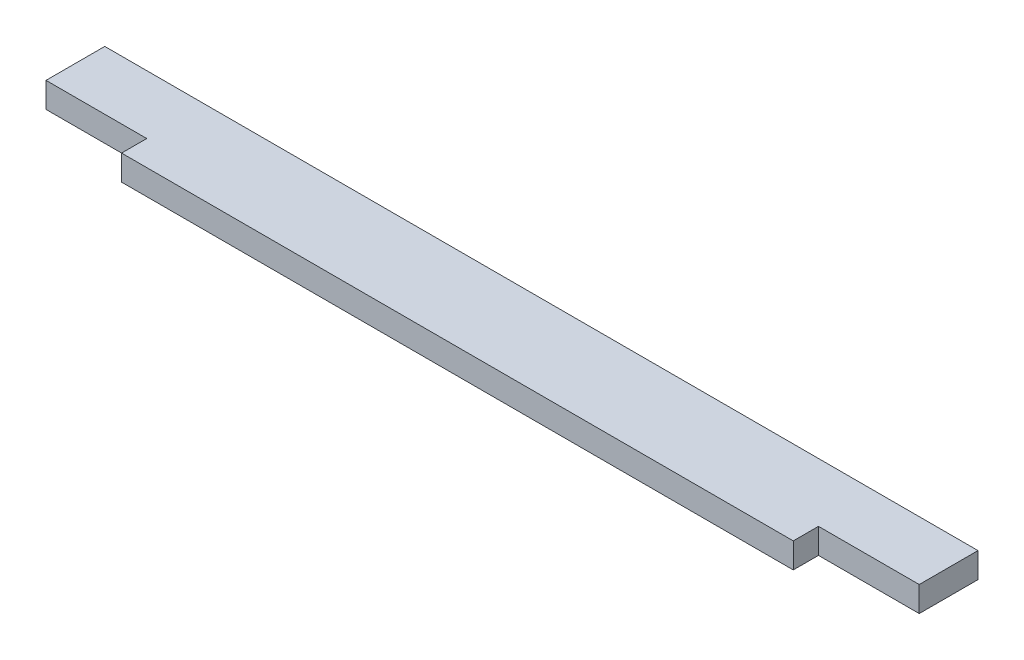
ISO-10303-21;
HEADER;
FILE_DESCRIPTION(('STEP AP214'),'2;1');
FILE_NAME('part.step','',(''),(''),'','','');
FILE_SCHEMA(('AUTOMOTIVE_DESIGN { 1 0 10303 214 1 1 1 1 }'));
ENDSEC;
DATA;
#1=APPLICATION_CONTEXT('core data for automotive mechanical design processes');
#2=APPLICATION_PROTOCOL_DEFINITION('international standard','automotive_design',2000,#1);
#3=PRODUCT_CONTEXT('',#1,'mechanical');
#4=PRODUCT('Part','Part','',(#3));
#5=PRODUCT_RELATED_PRODUCT_CATEGORY('part','',(#4));
#6=PRODUCT_DEFINITION_FORMATION('','',#4);
#7=PRODUCT_DEFINITION_CONTEXT('part definition',#1,'design');
#8=PRODUCT_DEFINITION('design','',#6,#7);
#9=PRODUCT_DEFINITION_SHAPE('','',#8);
#10=(LENGTH_UNIT() NAMED_UNIT(*) SI_UNIT(.MILLI.,.METRE.));
#11=(NAMED_UNIT(*) PLANE_ANGLE_UNIT() SI_UNIT($,.RADIAN.));
#12=(NAMED_UNIT(*) SI_UNIT($,.STERADIAN.) SOLID_ANGLE_UNIT());
#13=UNCERTAINTY_MEASURE_WITH_UNIT(LENGTH_MEASURE(1.E-05),#10,'distance_accuracy_value','');
#14=(GEOMETRIC_REPRESENTATION_CONTEXT(3) GLOBAL_UNCERTAINTY_ASSIGNED_CONTEXT((#13)) GLOBAL_UNIT_ASSIGNED_CONTEXT((#10,
#11,#12)) REPRESENTATION_CONTEXT('',''));
#15=CARTESIAN_POINT('',(0.,0.,0.));
#16=DIRECTION('',(0.,0.,1.));
#17=DIRECTION('',(1.,0.,0.));
#18=AXIS2_PLACEMENT_3D('',#15,#16,#17);
#19=CARTESIAN_POINT('',(52.,3.,-5.));
#20=DIRECTION('',(-1.,0.,0.));
#21=DIRECTION('',(0.,0.,1.));
#22=AXIS2_PLACEMENT_3D('',#19,#20,#21);
#23=PLANE('',#22);
#24=DIRECTION('',(0.,1.,0.));
#25=VECTOR('',#24,1.);
#26=CARTESIAN_POINT('',(52.,0.,1.99999999999999));
#27=LINE('',#26,#25);
#28=CARTESIAN_POINT('',(52.,0.,1.99999999999999));
#29=VERTEX_POINT('',#28);
#30=CARTESIAN_POINT('',(52.,3.,1.99999999999999));
#31=VERTEX_POINT('',#30);
#32=EDGE_CURVE('E127',#29,#31,#27,.T.);
#33=ORIENTED_EDGE('',*,*,#32,.F.);
#34=DIRECTION('',(0.,0.,-1.));
#35=VECTOR('',#34,1.);
#36=CARTESIAN_POINT('',(52.,0.,-5.));
#37=LINE('',#36,#35);
#38=CARTESIAN_POINT('',(52.,0.,-5.));
#39=VERTEX_POINT('',#38);
#40=EDGE_CURVE('E120',#29,#39,#37,.T.);
#41=ORIENTED_EDGE('',*,*,#40,.T.);
#42=DIRECTION('',(0.,-1.,0.));
#43=VECTOR('',#42,1.);
#44=CARTESIAN_POINT('',(52.,3.,-5.));
#45=LINE('',#44,#43);
#46=CARTESIAN_POINT('',(52.,3.,-5.));
#47=VERTEX_POINT('',#46);
#48=EDGE_CURVE('E11',#47,#39,#45,.T.);
#49=ORIENTED_EDGE('',*,*,#48,.F.);
#50=DIRECTION('',(0.,0.,-1.));
#51=VECTOR('',#50,1.);
#52=CARTESIAN_POINT('',(52.,3.,-5.));
#53=LINE('',#52,#51);
#54=EDGE_CURVE('E143',#31,#47,#53,.T.);
#55=ORIENTED_EDGE('',*,*,#54,.F.);
#56=EDGE_LOOP('',(#33,#41,#49,#55));
#57=FACE_BOUND('',#56,.T.);
#58=ADVANCED_FACE('F37',(#57),#23,.F.);
#59=CARTESIAN_POINT('',(-52.,3.,5.));
#60=DIRECTION('',(0.,0.,-1.));
#61=DIRECTION('',(-1.,0.,0.));
#62=AXIS2_PLACEMENT_3D('',#59,#60,#61);
#63=PLANE('',#62);
#64=DIRECTION('',(0.,1.,0.));
#65=VECTOR('',#64,1.);
#66=CARTESIAN_POINT('',(40.,0.,5.));
#67=LINE('',#66,#65);
#68=CARTESIAN_POINT('',(40.,0.,5.));
#69=VERTEX_POINT('',#68);
#70=CARTESIAN_POINT('',(40.,3.,5.));
#71=VERTEX_POINT('',#70);
#72=EDGE_CURVE('E59',#69,#71,#67,.T.);
#73=ORIENTED_EDGE('',*,*,#72,.T.);
#74=DIRECTION('',(1.,0.,0.));
#75=VECTOR('',#74,1.);
#76=CARTESIAN_POINT('',(-52.,3.,5.));
#77=LINE('',#76,#75);
#78=CARTESIAN_POINT('',(-40.,3.,5.));
#79=VERTEX_POINT('',#78);
#80=EDGE_CURVE('E151',#79,#71,#77,.T.);
#81=ORIENTED_EDGE('',*,*,#80,.F.);
#82=DIRECTION('',(0.,1.,0.));
#83=VECTOR('',#82,1.);
#84=CARTESIAN_POINT('',(-40.,0.,5.));
#85=LINE('',#84,#83);
#86=CARTESIAN_POINT('',(-40.,0.,5.));
#87=VERTEX_POINT('',#86);
#88=EDGE_CURVE('E125',#87,#79,#85,.T.);
#89=ORIENTED_EDGE('',*,*,#88,.F.);
#90=DIRECTION('',(1.,0.,0.));
#91=VECTOR('',#90,1.);
#92=CARTESIAN_POINT('',(-52.,0.,5.));
#93=LINE('',#92,#91);
#94=EDGE_CURVE('E146',#87,#69,#93,.T.);
#95=ORIENTED_EDGE('',*,*,#94,.T.);
#96=EDGE_LOOP('',(#73,#81,#89,#95));
#97=FACE_BOUND('',#96,.T.);
#98=ADVANCED_FACE('F183',(#97),#63,.F.);
#99=CARTESIAN_POINT('',(0.,3.,0.));
#100=DIRECTION('',(0.,1.,0.));
#101=DIRECTION('',(0.,0.,1.));
#102=AXIS2_PLACEMENT_3D('',#99,#100,#101);
#103=PLANE('',#102);
#104=DIRECTION('',(0.,0.,-1.));
#105=VECTOR('',#104,1.);
#106=CARTESIAN_POINT('',(40.,3.,0.));
#107=LINE('',#106,#105);
#108=CARTESIAN_POINT('',(40.,3.,1.99999999999999));
#109=VERTEX_POINT('',#108);
#110=EDGE_CURVE('E121',#71,#109,#107,.T.);
#111=ORIENTED_EDGE('',*,*,#110,.T.);
#112=DIRECTION('',(1.,0.,0.));
#113=VECTOR('',#112,1.);
#114=CARTESIAN_POINT('',(0.,3.,1.99999999999999));
#115=LINE('',#114,#113);
#116=EDGE_CURVE('E114',#109,#31,#115,.T.);
#117=ORIENTED_EDGE('',*,*,#116,.T.);
#118=ORIENTED_EDGE('',*,*,#54,.T.);
#119=DIRECTION('',(-1.,0.,0.));
#120=VECTOR('',#119,1.);
#121=CARTESIAN_POINT('',(-52.,3.,-5.));
#122=LINE('',#121,#120);
#123=CARTESIAN_POINT('',(-52.,3.,-5.));
#124=VERTEX_POINT('',#123);
#125=EDGE_CURVE('E145',#47,#124,#122,.T.);
#126=ORIENTED_EDGE('',*,*,#125,.T.);
#127=DIRECTION('',(0.,0.,1.));
#128=VECTOR('',#127,1.);
#129=CARTESIAN_POINT('',(-52.,3.,-5.));
#130=LINE('',#129,#128);
#131=CARTESIAN_POINT('',(-52.,3.,1.99999999999999));
#132=VERTEX_POINT('',#131);
#133=EDGE_CURVE('E148',#124,#132,#130,.T.);
#134=ORIENTED_EDGE('',*,*,#133,.T.);
#135=DIRECTION('',(-1.,0.,0.));
#136=VECTOR('',#135,1.);
#137=CARTESIAN_POINT('',(0.,3.,1.99999999999999));
#138=LINE('',#137,#136);
#139=CARTESIAN_POINT('',(-40.,3.,1.99999999999999));
#140=VERTEX_POINT('',#139);
#141=EDGE_CURVE('E133',#140,#132,#138,.T.);
#142=ORIENTED_EDGE('',*,*,#141,.F.);
#143=DIRECTION('',(0.,0.,1.));
#144=VECTOR('',#143,1.);
#145=CARTESIAN_POINT('',(-40.,3.,0.));
#146=LINE('',#145,#144);
#147=EDGE_CURVE('E136',#140,#79,#146,.T.);
#148=ORIENTED_EDGE('',*,*,#147,.T.);
#149=ORIENTED_EDGE('',*,*,#80,.T.);
#150=EDGE_LOOP('',(#111,#117,#118,#126,#134,#142,#148,#149));
#151=FACE_BOUND('',#150,.T.);
#152=ADVANCED_FACE('F177',(#151),#103,.T.);
#153=CARTESIAN_POINT('',(0.,0.,0.));
#154=DIRECTION('',(0.,1.,0.));
#155=DIRECTION('',(0.,0.,1.));
#156=AXIS2_PLACEMENT_3D('',#153,#154,#155);
#157=PLANE('',#156);
#158=DIRECTION('',(1.,0.,0.));
#159=VECTOR('',#158,1.);
#160=CARTESIAN_POINT('',(0.,0.,1.99999999999999));
#161=LINE('',#160,#159);
#162=CARTESIAN_POINT('',(40.,0.,1.99999999999999));
#163=VERTEX_POINT('',#162);
#164=EDGE_CURVE('E108',#163,#29,#161,.T.);
#165=ORIENTED_EDGE('',*,*,#164,.F.);
#166=DIRECTION('',(0.,0.,-1.));
#167=VECTOR('',#166,1.);
#168=CARTESIAN_POINT('',(40.,0.,0.));
#169=LINE('',#168,#167);
#170=EDGE_CURVE('E99',#69,#163,#169,.T.);
#171=ORIENTED_EDGE('',*,*,#170,.F.);
#172=ORIENTED_EDGE('',*,*,#94,.F.);
#173=DIRECTION('',(0.,0.,1.));
#174=VECTOR('',#173,1.);
#175=CARTESIAN_POINT('',(-40.,0.,0.));
#176=LINE('',#175,#174);
#177=CARTESIAN_POINT('',(-40.,0.,1.99999999999999));
#178=VERTEX_POINT('',#177);
#179=EDGE_CURVE('E130',#178,#87,#176,.T.);
#180=ORIENTED_EDGE('',*,*,#179,.F.);
#181=DIRECTION('',(-1.,0.,0.));
#182=VECTOR('',#181,1.);
#183=CARTESIAN_POINT('',(0.,0.,1.99999999999999));
#184=LINE('',#183,#182);
#185=CARTESIAN_POINT('',(-52.,0.,1.99999999999999));
#186=VERTEX_POINT('',#185);
#187=EDGE_CURVE('E132',#178,#186,#184,.T.);
#188=ORIENTED_EDGE('',*,*,#187,.T.);
#189=DIRECTION('',(0.,0.,1.));
#190=VECTOR('',#189,1.);
#191=CARTESIAN_POINT('',(-52.,0.,-5.));
#192=LINE('',#191,#190);
#193=CARTESIAN_POINT('',(-52.,0.,-5.));
#194=VERTEX_POINT('',#193);
#195=EDGE_CURVE('E157',#194,#186,#192,.T.);
#196=ORIENTED_EDGE('',*,*,#195,.F.);
#197=DIRECTION('',(-1.,0.,0.));
#198=VECTOR('',#197,1.);
#199=CARTESIAN_POINT('',(-52.,0.,-5.));
#200=LINE('',#199,#198);
#201=EDGE_CURVE('E155',#39,#194,#200,.T.);
#202=ORIENTED_EDGE('',*,*,#201,.F.);
#203=ORIENTED_EDGE('',*,*,#40,.F.);
#204=EDGE_LOOP('',(#165,#171,#172,#180,#188,#196,#202,#203));
#205=FACE_BOUND('',#204,.T.);
#206=ADVANCED_FACE('F118',(#205),#157,.F.);
#207=CARTESIAN_POINT('',(-52.,3.,-5.));
#208=DIRECTION('',(0.,0.,1.));
#209=DIRECTION('',(1.,0.,0.));
#210=AXIS2_PLACEMENT_3D('',#207,#208,#209);
#211=PLANE('',#210);
#212=ORIENTED_EDGE('',*,*,#201,.T.);
#213=DIRECTION('',(0.,-1.,0.));
#214=VECTOR('',#213,1.);
#215=CARTESIAN_POINT('',(-52.,3.,-5.));
#216=LINE('',#215,#214);
#217=EDGE_CURVE('E44',#124,#194,#216,.T.);
#218=ORIENTED_EDGE('',*,*,#217,.F.);
#219=ORIENTED_EDGE('',*,*,#125,.F.);
#220=ORIENTED_EDGE('',*,*,#48,.T.);
#221=EDGE_LOOP('',(#212,#218,#219,#220));
#222=FACE_BOUND('',#221,.T.);
#223=ADVANCED_FACE('F180',(#222),#211,.F.);
#224=CARTESIAN_POINT('',(-52.,3.,-5.));
#225=DIRECTION('',(1.,0.,0.));
#226=DIRECTION('',(0.,0.,-1.));
#227=AXIS2_PLACEMENT_3D('',#224,#225,#226);
#228=PLANE('',#227);
#229=ORIENTED_EDGE('',*,*,#195,.T.);
#230=DIRECTION('',(0.,1.,0.));
#231=VECTOR('',#230,1.);
#232=CARTESIAN_POINT('',(-52.,0.,1.99999999999999));
#233=LINE('',#232,#231);
#234=EDGE_CURVE('E51',#186,#132,#233,.T.);
#235=ORIENTED_EDGE('',*,*,#234,.T.);
#236=ORIENTED_EDGE('',*,*,#133,.F.);
#237=ORIENTED_EDGE('',*,*,#217,.T.);
#238=EDGE_LOOP('',(#229,#235,#236,#237));
#239=FACE_BOUND('',#238,.T.);
#240=ADVANCED_FACE('F165',(#239),#228,.F.);
#241=CARTESIAN_POINT('',(-40.,0.,0.));
#242=DIRECTION('',(-1.,0.,0.));
#243=DIRECTION('',(0.,0.,1.));
#244=AXIS2_PLACEMENT_3D('',#241,#242,#243);
#245=PLANE('',#244);
#246=ORIENTED_EDGE('',*,*,#147,.F.);
#247=DIRECTION('',(0.,1.,0.));
#248=VECTOR('',#247,1.);
#249=CARTESIAN_POINT('',(-40.,0.,1.99999999999999));
#250=LINE('',#249,#248);
#251=EDGE_CURVE('E135',#178,#140,#250,.T.);
#252=ORIENTED_EDGE('',*,*,#251,.F.);
#253=ORIENTED_EDGE('',*,*,#179,.T.);
#254=ORIENTED_EDGE('',*,*,#88,.T.);
#255=EDGE_LOOP('',(#246,#252,#253,#254));
#256=FACE_BOUND('',#255,.T.);
#257=ADVANCED_FACE('F173',(#256),#245,.T.);
#258=CARTESIAN_POINT('',(0.,0.,1.99999999999999));
#259=DIRECTION('',(0.,0.,-1.));
#260=DIRECTION('',(-1.,0.,0.));
#261=AXIS2_PLACEMENT_3D('',#258,#259,#260);
#262=PLANE('',#261);
#263=ORIENTED_EDGE('',*,*,#141,.T.);
#264=ORIENTED_EDGE('',*,*,#234,.F.);
#265=ORIENTED_EDGE('',*,*,#187,.F.);
#266=ORIENTED_EDGE('',*,*,#251,.T.);
#267=EDGE_LOOP('',(#263,#264,#265,#266));
#268=FACE_BOUND('',#267,.T.);
#269=ADVANCED_FACE('F169',(#268),#262,.F.);
#270=CARTESIAN_POINT('',(0.,0.,1.99999999999999));
#271=DIRECTION('',(0.,0.,1.));
#272=DIRECTION('',(1.,0.,0.));
#273=AXIS2_PLACEMENT_3D('',#270,#271,#272);
#274=PLANE('',#273);
#275=ORIENTED_EDGE('',*,*,#116,.F.);
#276=DIRECTION('',(0.,1.,0.));
#277=VECTOR('',#276,1.);
#278=CARTESIAN_POINT('',(40.,0.,1.99999999999999));
#279=LINE('',#278,#277);
#280=EDGE_CURVE('E102',#163,#109,#279,.T.);
#281=ORIENTED_EDGE('',*,*,#280,.F.);
#282=ORIENTED_EDGE('',*,*,#164,.T.);
#283=ORIENTED_EDGE('',*,*,#32,.T.);
#284=EDGE_LOOP('',(#275,#281,#282,#283));
#285=FACE_BOUND('',#284,.T.);
#286=ADVANCED_FACE('F111',(#285),#274,.T.);
#287=CARTESIAN_POINT('',(40.,0.,0.));
#288=DIRECTION('',(1.,0.,0.));
#289=DIRECTION('',(0.,0.,-1.));
#290=AXIS2_PLACEMENT_3D('',#287,#288,#289);
#291=PLANE('',#290);
#292=ORIENTED_EDGE('',*,*,#110,.F.);
#293=ORIENTED_EDGE('',*,*,#72,.F.);
#294=ORIENTED_EDGE('',*,*,#170,.T.);
#295=ORIENTED_EDGE('',*,*,#280,.T.);
#296=EDGE_LOOP('',(#292,#293,#294,#295));
#297=FACE_BOUND('',#296,.T.);
#298=ADVANCED_FACE('F101',(#297),#291,.T.);
#299=CLOSED_SHELL('',(#58,#98,#152,#206,#223,#240,#257,#269,#286,#298));
#300=MANIFOLD_SOLID_BREP('B2',#299);
#301=ADVANCED_BREP_SHAPE_REPRESENTATION('',(#18,#300),#14);
#302=SHAPE_DEFINITION_REPRESENTATION(#9,#301);
ENDSEC;
END-ISO-10303-21;
